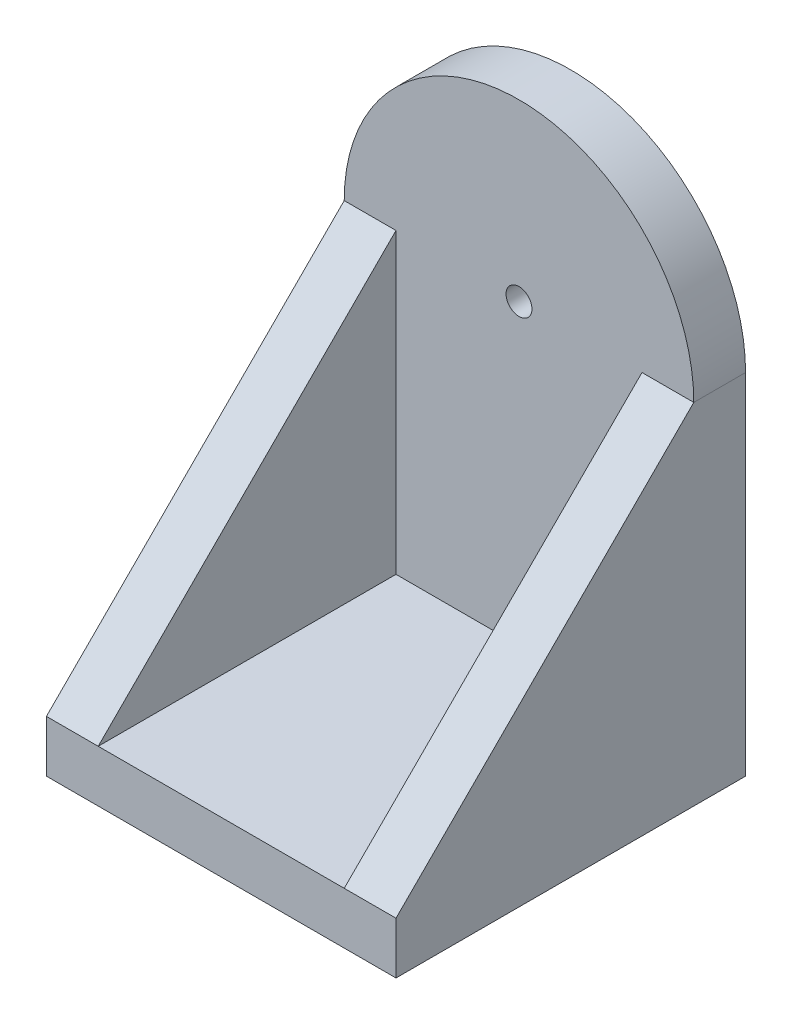
ISO-10303-21;
HEADER;
FILE_DESCRIPTION(('STEP AP214'),'2;1');
FILE_NAME('part.step','',(''),(''),'','','');
FILE_SCHEMA(('AUTOMOTIVE_DESIGN { 1 0 10303 214 1 1 1 1 }'));
ENDSEC;
DATA;
#1=APPLICATION_CONTEXT('core data for automotive mechanical design processes');
#2=APPLICATION_PROTOCOL_DEFINITION('international standard','automotive_design',2000,#1);
#3=PRODUCT_CONTEXT('',#1,'mechanical');
#4=PRODUCT('Part','Part','',(#3));
#5=PRODUCT_RELATED_PRODUCT_CATEGORY('part','',(#4));
#6=PRODUCT_DEFINITION_FORMATION('','',#4);
#7=PRODUCT_DEFINITION_CONTEXT('part definition',#1,'design');
#8=PRODUCT_DEFINITION('design','',#6,#7);
#9=PRODUCT_DEFINITION_SHAPE('','',#8);
#10=(LENGTH_UNIT() NAMED_UNIT(*) SI_UNIT(.MILLI.,.METRE.));
#11=(NAMED_UNIT(*) PLANE_ANGLE_UNIT() SI_UNIT($,.RADIAN.));
#12=(NAMED_UNIT(*) SI_UNIT($,.STERADIAN.) SOLID_ANGLE_UNIT());
#13=UNCERTAINTY_MEASURE_WITH_UNIT(LENGTH_MEASURE(1.E-05),#10,'distance_accuracy_value','');
#14=(GEOMETRIC_REPRESENTATION_CONTEXT(3) GLOBAL_UNCERTAINTY_ASSIGNED_CONTEXT((#13)) GLOBAL_UNIT_ASSIGNED_CONTEXT((#10,
#11,#12)) REPRESENTATION_CONTEXT('',''));
#15=CARTESIAN_POINT('',(0.,0.,0.));
#16=DIRECTION('',(0.,0.,1.));
#17=DIRECTION('',(1.,0.,0.));
#18=AXIS2_PLACEMENT_3D('',#15,#16,#17);
#19=CARTESIAN_POINT('',(0.,0.,20.));
#20=DIRECTION('',(0.,0.,-1.));
#21=DIRECTION('',(-1.,0.,0.));
#22=AXIS2_PLACEMENT_3D('',#19,#20,#21);
#23=PLANE('',#22);
#24=CARTESIAN_POINT('',(0.,0.,20.));
#25=DIRECTION('',(0.,0.,1.));
#26=DIRECTION('',(1.,0.,0.));
#27=AXIS2_PLACEMENT_3D('',#24,#25,#26);
#28=CIRCLE('',#27,5.);
#29=CARTESIAN_POINT('',(5.,0.,20.));
#30=VERTEX_POINT('',#29);
#31=EDGE_CURVE('E184',#30,#30,#28,.T.);
#32=ORIENTED_EDGE('',*,*,#31,.F.);
#33=EDGE_LOOP('',(#32));
#34=FACE_BOUND('',#33,.T.);
#35=DIRECTION('',(-1.,0.,0.));
#36=VECTOR('',#35,1.);
#37=CARTESIAN_POINT('',(-47.5,-115.,20.));
#38=LINE('',#37,#36);
#39=CARTESIAN_POINT('',(47.5,-115.,20.));
#40=VERTEX_POINT('',#39);
#41=CARTESIAN_POINT('',(-47.5,-115.,20.));
#42=VERTEX_POINT('',#41);
#43=EDGE_CURVE('E61',#40,#42,#38,.T.);
#44=ORIENTED_EDGE('',*,*,#43,.F.);
#45=DIRECTION('',(0.,1.,0.));
#46=VECTOR('',#45,1.);
#47=CARTESIAN_POINT('',(47.5,-135.,20.));
#48=LINE('',#47,#46);
#49=CARTESIAN_POINT('',(47.5000000000001,0.,20.));
#50=VERTEX_POINT('',#49);
#51=EDGE_CURVE('E160',#40,#50,#48,.T.);
#52=ORIENTED_EDGE('',*,*,#51,.T.);
#53=DIRECTION('',(1.,0.,0.));
#54=VECTOR('',#53,1.);
#55=CARTESIAN_POINT('',(47.5000000000001,0.,20.));
#56=LINE('',#55,#54);
#57=CARTESIAN_POINT('',(67.5000000000001,0.,20.));
#58=VERTEX_POINT('',#57);
#59=EDGE_CURVE('E167',#50,#58,#56,.T.);
#60=ORIENTED_EDGE('',*,*,#59,.T.);
#61=CARTESIAN_POINT('',(0.,0.,20.));
#62=DIRECTION('',(0.,0.,1.));
#63=DIRECTION('',(-1.,0.,0.));
#64=AXIS2_PLACEMENT_3D('',#61,#62,#63);
#65=CIRCLE('',#64,67.5000000000001);
#66=CARTESIAN_POINT('',(-67.5000000000001,0.,20.));
#67=VERTEX_POINT('',#66);
#68=EDGE_CURVE('E192',#58,#67,#65,.T.);
#69=ORIENTED_EDGE('',*,*,#68,.T.);
#70=DIRECTION('',(-1.,0.,0.));
#71=VECTOR('',#70,1.);
#72=CARTESIAN_POINT('',(-47.5000000000001,0.,20.));
#73=LINE('',#72,#71);
#74=CARTESIAN_POINT('',(-47.5000000000001,0.,20.));
#75=VERTEX_POINT('',#74);
#76=EDGE_CURVE('E128',#75,#67,#73,.T.);
#77=ORIENTED_EDGE('',*,*,#76,.F.);
#78=DIRECTION('',(0.,1.,0.));
#79=VECTOR('',#78,1.);
#80=CARTESIAN_POINT('',(-47.5,-135.,20.));
#81=LINE('',#80,#79);
#82=EDGE_CURVE('E112',#42,#75,#81,.T.);
#83=ORIENTED_EDGE('',*,*,#82,.F.);
#84=EDGE_LOOP('',(#44,#52,#60,#69,#77,#83));
#85=FACE_BOUND('',#84,.T.);
#86=ADVANCED_FACE('F45',(#34,#85),#23,.F.);
#87=CARTESIAN_POINT('',(47.5000000000001,0.,0.));
#88=DIRECTION('',(-1.,0.,0.));
#89=DIRECTION('',(0.,-1.,0.));
#90=AXIS2_PLACEMENT_3D('',#87,#88,#89);
#91=PLANE('',#90);
#92=ORIENTED_EDGE('',*,*,#51,.F.);
#93=DIRECTION('',(0.,0.,-1.));
#94=VECTOR('',#93,1.);
#95=CARTESIAN_POINT('',(47.5,-115.,232.082439194737));
#96=LINE('',#95,#94);
#97=CARTESIAN_POINT('',(47.5,-115.,134.999999999999));
#98=VERTEX_POINT('',#97);
#99=EDGE_CURVE('E141',#98,#40,#96,.T.);
#100=ORIENTED_EDGE('',*,*,#99,.F.);
#101=DIRECTION('',(0.,-0.707106781186551,0.707106781186544));
#102=VECTOR('',#101,1.);
#103=CARTESIAN_POINT('',(47.5000000000001,0.,20.));
#104=LINE('',#103,#102);
#105=EDGE_CURVE('E163',#50,#98,#104,.T.);
#106=ORIENTED_EDGE('',*,*,#105,.F.);
#107=EDGE_LOOP('',(#92,#100,#106));
#108=FACE_BOUND('',#107,.T.);
#109=ADVANCED_FACE('F238',(#108),#91,.T.);
#110=CARTESIAN_POINT('',(-47.5000000000001,0.,0.));
#111=DIRECTION('',(1.,0.,0.));
#112=DIRECTION('',(0.,-1.,0.));
#113=AXIS2_PLACEMENT_3D('',#110,#111,#112);
#114=PLANE('',#113);
#115=DIRECTION('',(0.,-0.707106781186551,0.707106781186544));
#116=VECTOR('',#115,1.);
#117=CARTESIAN_POINT('',(-47.5000000000001,0.,20.));
#118=LINE('',#117,#116);
#119=CARTESIAN_POINT('',(-47.5,-115.,134.999999999999));
#120=VERTEX_POINT('',#119);
#121=EDGE_CURVE('E109',#75,#120,#118,.T.);
#122=ORIENTED_EDGE('',*,*,#121,.T.);
#123=DIRECTION('',(0.,0.,-1.));
#124=VECTOR('',#123,1.);
#125=CARTESIAN_POINT('',(-47.5,-115.,232.082439194737));
#126=LINE('',#125,#124);
#127=EDGE_CURVE('E69',#120,#42,#126,.T.);
#128=ORIENTED_EDGE('',*,*,#127,.T.);
#129=ORIENTED_EDGE('',*,*,#82,.T.);
#130=EDGE_LOOP('',(#122,#128,#129));
#131=FACE_BOUND('',#130,.T.);
#132=ADVANCED_FACE('F111',(#131),#114,.T.);
#133=CARTESIAN_POINT('',(0.,0.,0.));
#134=DIRECTION('',(0.,0.,-1.));
#135=DIRECTION('',(-1.,0.,0.));
#136=AXIS2_PLACEMENT_3D('',#133,#134,#135);
#137=PLANE('',#136);
#138=DIRECTION('',(1.,0.,0.));
#139=VECTOR('',#138,1.);
#140=CARTESIAN_POINT('',(67.5,-135.,0.));
#141=LINE('',#140,#139);
#142=CARTESIAN_POINT('',(-67.5,-135.,0.));
#143=VERTEX_POINT('',#142);
#144=CARTESIAN_POINT('',(67.5,-135.,0.));
#145=VERTEX_POINT('',#144);
#146=EDGE_CURVE('E188',#143,#145,#141,.T.);
#147=ORIENTED_EDGE('',*,*,#146,.F.);
#148=DIRECTION('',(0.,-1.,0.));
#149=VECTOR('',#148,1.);
#150=CARTESIAN_POINT('',(-67.5,-135.,0.));
#151=LINE('',#150,#149);
#152=CARTESIAN_POINT('',(-67.5000000000001,0.,0.));
#153=VERTEX_POINT('',#152);
#154=EDGE_CURVE('E196',#153,#143,#151,.T.);
#155=ORIENTED_EDGE('',*,*,#154,.F.);
#156=CARTESIAN_POINT('',(0.,0.,0.));
#157=DIRECTION('',(0.,0.,1.));
#158=DIRECTION('',(-1.,0.,0.));
#159=AXIS2_PLACEMENT_3D('',#156,#157,#158);
#160=CIRCLE('',#159,67.5000000000001);
#161=CARTESIAN_POINT('',(67.5000000000001,0.,0.));
#162=VERTEX_POINT('',#161);
#163=EDGE_CURVE('E203',#162,#153,#160,.T.);
#164=ORIENTED_EDGE('',*,*,#163,.F.);
#165=DIRECTION('',(0.,1.,0.));
#166=VECTOR('',#165,1.);
#167=CARTESIAN_POINT('',(67.5000000000001,0.,0.));
#168=LINE('',#167,#166);
#169=EDGE_CURVE('E200',#145,#162,#168,.T.);
#170=ORIENTED_EDGE('',*,*,#169,.F.);
#171=EDGE_LOOP('',(#147,#155,#164,#170));
#172=FACE_BOUND('',#171,.T.);
#173=CARTESIAN_POINT('',(0.,0.,0.));
#174=DIRECTION('',(0.,0.,1.));
#175=DIRECTION('',(1.,0.,0.));
#176=AXIS2_PLACEMENT_3D('',#173,#174,#175);
#177=CIRCLE('',#176,5.);
#178=CARTESIAN_POINT('',(5.,0.,0.));
#179=VERTEX_POINT('',#178);
#180=EDGE_CURVE('E178',#179,#179,#177,.T.);
#181=ORIENTED_EDGE('',*,*,#180,.T.);
#182=EDGE_LOOP('',(#181));
#183=FACE_BOUND('',#182,.T.);
#184=ADVANCED_FACE('F226',(#172,#183),#137,.T.);
#185=CARTESIAN_POINT('',(67.5,-135.,20.));
#186=DIRECTION('',(0.,1.,0.));
#187=DIRECTION('',(0.,0.,1.));
#188=AXIS2_PLACEMENT_3D('',#185,#186,#187);
#189=PLANE('',#188);
#190=ORIENTED_EDGE('',*,*,#146,.T.);
#191=DIRECTION('',(0.,0.,-1.));
#192=VECTOR('',#191,1.);
#193=CARTESIAN_POINT('',(67.5,-135.,20.));
#194=LINE('',#193,#192);
#195=CARTESIAN_POINT('',(67.5,-135.,134.999999999999));
#196=VERTEX_POINT('',#195);
#197=EDGE_CURVE('E11',#196,#145,#194,.T.);
#198=ORIENTED_EDGE('',*,*,#197,.F.);
#199=DIRECTION('',(1.,0.,0.));
#200=VECTOR('',#199,1.);
#201=CARTESIAN_POINT('',(47.5,-135.,134.999999999999));
#202=LINE('',#201,#200);
#203=CARTESIAN_POINT('',(-67.5,-135.,134.999999999999));
#204=VERTEX_POINT('',#203);
#205=EDGE_CURVE('E174',#204,#196,#202,.T.);
#206=ORIENTED_EDGE('',*,*,#205,.F.);
#207=DIRECTION('',(0.,0.,-1.));
#208=VECTOR('',#207,1.);
#209=CARTESIAN_POINT('',(-67.5,-135.,20.));
#210=LINE('',#209,#208);
#211=EDGE_CURVE('E195',#204,#143,#210,.T.);
#212=ORIENTED_EDGE('',*,*,#211,.T.);
#213=EDGE_LOOP('',(#190,#198,#206,#212));
#214=FACE_BOUND('',#213,.T.);
#215=ADVANCED_FACE('F47',(#214),#189,.F.);
#216=CARTESIAN_POINT('',(67.5000000000001,0.,20.));
#217=DIRECTION('',(-1.,0.,0.));
#218=DIRECTION('',(0.,-1.,0.));
#219=AXIS2_PLACEMENT_3D('',#216,#217,#218);
#220=PLANE('',#219);
#221=ORIENTED_EDGE('',*,*,#169,.T.);
#222=DIRECTION('',(0.,0.,-1.));
#223=VECTOR('',#222,1.);
#224=CARTESIAN_POINT('',(67.5000000000001,0.,20.));
#225=LINE('',#224,#223);
#226=EDGE_CURVE('E54',#58,#162,#225,.T.);
#227=ORIENTED_EDGE('',*,*,#226,.F.);
#228=DIRECTION('',(0.,-0.707106781186551,0.707106781186544));
#229=VECTOR('',#228,1.);
#230=CARTESIAN_POINT('',(67.5000000000001,0.,20.));
#231=LINE('',#230,#229);
#232=CARTESIAN_POINT('',(67.5,-115.,134.999999999999));
#233=VERTEX_POINT('',#232);
#234=EDGE_CURVE('E158',#58,#233,#231,.T.);
#235=ORIENTED_EDGE('',*,*,#234,.T.);
#236=DIRECTION('',(0.,-1.,0.));
#237=VECTOR('',#236,1.);
#238=CARTESIAN_POINT('',(67.5,-115.,134.999999999999));
#239=LINE('',#238,#237);
#240=EDGE_CURVE('E164',#233,#196,#239,.T.);
#241=ORIENTED_EDGE('',*,*,#240,.T.);
#242=ORIENTED_EDGE('',*,*,#197,.T.);
#243=EDGE_LOOP('',(#221,#227,#235,#241,#242));
#244=FACE_BOUND('',#243,.T.);
#245=ADVANCED_FACE('F232',(#244),#220,.F.);
#246=CARTESIAN_POINT('',(0.,0.,20.));
#247=DIRECTION('',(0.,0.,-1.));
#248=DIRECTION('',(-1.,0.,0.));
#249=AXIS2_PLACEMENT_3D('',#246,#247,#248);
#250=CYLINDRICAL_SURFACE('',#249,67.5000000000001);
#251=ORIENTED_EDGE('',*,*,#163,.T.);
#252=DIRECTION('',(0.,0.,-1.));
#253=VECTOR('',#252,1.);
#254=CARTESIAN_POINT('',(-67.5000000000001,0.,20.));
#255=LINE('',#254,#253);
#256=EDGE_CURVE('E211',#67,#153,#255,.T.);
#257=ORIENTED_EDGE('',*,*,#256,.F.);
#258=ORIENTED_EDGE('',*,*,#68,.F.);
#259=ORIENTED_EDGE('',*,*,#226,.T.);
#260=EDGE_LOOP('',(#251,#257,#258,#259));
#261=FACE_BOUND('',#260,.T.);
#262=ADVANCED_FACE('F220',(#261),#250,.T.);
#263=CARTESIAN_POINT('',(-67.5,-135.,20.));
#264=DIRECTION('',(1.,0.,0.));
#265=DIRECTION('',(0.,1.,0.));
#266=AXIS2_PLACEMENT_3D('',#263,#264,#265);
#267=PLANE('',#266);
#268=ORIENTED_EDGE('',*,*,#154,.T.);
#269=ORIENTED_EDGE('',*,*,#211,.F.);
#270=DIRECTION('',(0.,-1.,0.));
#271=VECTOR('',#270,1.);
#272=CARTESIAN_POINT('',(-67.5,-115.,134.999999999999));
#273=LINE('',#272,#271);
#274=CARTESIAN_POINT('',(-67.5,-115.,134.999999999999));
#275=VERTEX_POINT('',#274);
#276=EDGE_CURVE('E140',#275,#204,#273,.T.);
#277=ORIENTED_EDGE('',*,*,#276,.F.);
#278=DIRECTION('',(0.,-0.707106781186551,0.707106781186544));
#279=VECTOR('',#278,1.);
#280=CARTESIAN_POINT('',(-67.5000000000001,0.,20.));
#281=LINE('',#280,#279);
#282=EDGE_CURVE('E123',#67,#275,#281,.T.);
#283=ORIENTED_EDGE('',*,*,#282,.F.);
#284=ORIENTED_EDGE('',*,*,#256,.T.);
#285=EDGE_LOOP('',(#268,#269,#277,#283,#284));
#286=FACE_BOUND('',#285,.T.);
#287=ADVANCED_FACE('F230',(#286),#267,.F.);
#288=CARTESIAN_POINT('',(0.,0.,20.));
#289=DIRECTION('',(0.,0.,-1.));
#290=DIRECTION('',(-1.,0.,0.));
#291=AXIS2_PLACEMENT_3D('',#288,#289,#290);
#292=CYLINDRICAL_SURFACE('',#291,5.);
#293=ORIENTED_EDGE('',*,*,#31,.T.);
#294=EDGE_LOOP('',(#293));
#295=FACE_BOUND('',#294,.T.);
#296=ORIENTED_EDGE('',*,*,#180,.F.);
#297=EDGE_LOOP('',(#296));
#298=FACE_BOUND('',#297,.T.);
#299=ADVANCED_FACE('F252',(#295,#298),#292,.F.);
#300=CARTESIAN_POINT('',(47.5,-115.,134.999999999999));
#301=DIRECTION('',(0.,0.,1.));
#302=DIRECTION('',(0.,-1.,0.));
#303=AXIS2_PLACEMENT_3D('',#300,#301,#302);
#304=PLANE('',#303);
#305=ORIENTED_EDGE('',*,*,#240,.F.);
#306=DIRECTION('',(1.,0.,0.));
#307=VECTOR('',#306,1.);
#308=CARTESIAN_POINT('',(47.5,-115.,134.999999999999));
#309=LINE('',#308,#307);
#310=EDGE_CURVE('E135',#98,#233,#309,.T.);
#311=ORIENTED_EDGE('',*,*,#310,.F.);
#312=DIRECTION('',(1.,0.,0.));
#313=VECTOR('',#312,1.);
#314=CARTESIAN_POINT('',(-47.5,-115.,134.999999999999));
#315=LINE('',#314,#313);
#316=EDGE_CURVE('E132',#120,#98,#315,.T.);
#317=ORIENTED_EDGE('',*,*,#316,.F.);
#318=DIRECTION('',(-1.,0.,0.));
#319=VECTOR('',#318,1.);
#320=CARTESIAN_POINT('',(-47.5,-115.,134.999999999999));
#321=LINE('',#320,#319);
#322=EDGE_CURVE('E117',#120,#275,#321,.T.);
#323=ORIENTED_EDGE('',*,*,#322,.T.);
#324=ORIENTED_EDGE('',*,*,#276,.T.);
#325=ORIENTED_EDGE('',*,*,#205,.T.);
#326=EDGE_LOOP('',(#305,#311,#317,#323,#324,#325));
#327=FACE_BOUND('',#326,.T.);
#328=ADVANCED_FACE('F134',(#327),#304,.T.);
#329=CARTESIAN_POINT('',(47.5000000000001,0.,20.));
#330=DIRECTION('',(0.,0.707106781186544,0.707106781186551));
#331=DIRECTION('',(0.,-0.707106781186551,0.707106781186544));
#332=AXIS2_PLACEMENT_3D('',#329,#330,#331);
#333=PLANE('',#332);
#334=ORIENTED_EDGE('',*,*,#234,.F.);
#335=ORIENTED_EDGE('',*,*,#59,.F.);
#336=ORIENTED_EDGE('',*,*,#105,.T.);
#337=ORIENTED_EDGE('',*,*,#310,.T.);
#338=EDGE_LOOP('',(#334,#335,#336,#337));
#339=FACE_BOUND('',#338,.T.);
#340=ADVANCED_FACE('F235',(#339),#333,.T.);
#341=CARTESIAN_POINT('',(-47.5000000000001,0.,20.));
#342=DIRECTION('',(0.,-0.707106781186544,-0.707106781186551));
#343=DIRECTION('',(0.,0.707106781186551,-0.707106781186544));
#344=AXIS2_PLACEMENT_3D('',#341,#342,#343);
#345=PLANE('',#344);
#346=ORIENTED_EDGE('',*,*,#282,.T.);
#347=ORIENTED_EDGE('',*,*,#322,.F.);
#348=ORIENTED_EDGE('',*,*,#121,.F.);
#349=ORIENTED_EDGE('',*,*,#76,.T.);
#350=EDGE_LOOP('',(#346,#347,#348,#349));
#351=FACE_BOUND('',#350,.T.);
#352=ADVANCED_FACE('F121',(#351),#345,.F.);
#353=CARTESIAN_POINT('',(-47.5,-115.,232.082439194737));
#354=DIRECTION('',(0.,-1.,0.));
#355=DIRECTION('',(0.,0.,-1.));
#356=AXIS2_PLACEMENT_3D('',#353,#354,#355);
#357=PLANE('',#356);
#358=ORIENTED_EDGE('',*,*,#127,.F.);
#359=ORIENTED_EDGE('',*,*,#316,.T.);
#360=ORIENTED_EDGE('',*,*,#99,.T.);
#361=ORIENTED_EDGE('',*,*,#43,.T.);
#362=EDGE_LOOP('',(#358,#359,#360,#361));
#363=FACE_BOUND('',#362,.T.);
#364=ADVANCED_FACE('F143',(#363),#357,.F.);
#365=CLOSED_SHELL('',(#86,#109,#132,#184,#215,#245,#262,#287,#299,#328,#340,#352,#364));
#366=MANIFOLD_SOLID_BREP('B2',#365);
#367=ADVANCED_BREP_SHAPE_REPRESENTATION('',(#18,#366),#14);
#368=SHAPE_DEFINITION_REPRESENTATION(#9,#367);
ENDSEC;
END-ISO-10303-21;
